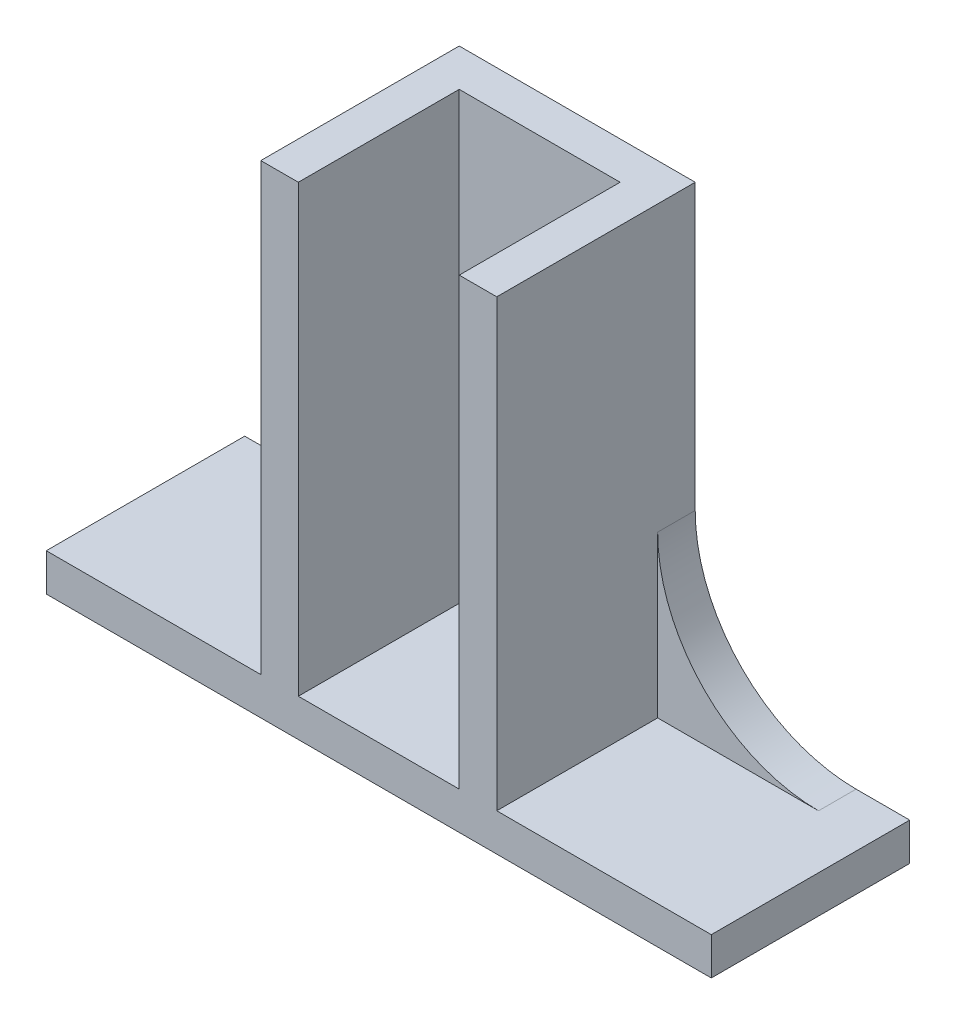
ISO-10303-21;
HEADER;
FILE_DESCRIPTION(('STEP AP214'),'2;1');
FILE_NAME('part.step','',(''),(''),'','','');
FILE_SCHEMA(('AUTOMOTIVE_DESIGN { 1 0 10303 214 1 1 1 1 }'));
ENDSEC;
DATA;
#1=APPLICATION_CONTEXT('core data for automotive mechanical design processes');
#2=APPLICATION_PROTOCOL_DEFINITION('international standard','automotive_design',2000,#1);
#3=PRODUCT_CONTEXT('',#1,'mechanical');
#4=PRODUCT('Part','Part','',(#3));
#5=PRODUCT_RELATED_PRODUCT_CATEGORY('part','',(#4));
#6=PRODUCT_DEFINITION_FORMATION('','',#4);
#7=PRODUCT_DEFINITION_CONTEXT('part definition',#1,'design');
#8=PRODUCT_DEFINITION('design','',#6,#7);
#9=PRODUCT_DEFINITION_SHAPE('','',#8);
#10=(LENGTH_UNIT() NAMED_UNIT(*) SI_UNIT(.MILLI.,.METRE.));
#11=(NAMED_UNIT(*) PLANE_ANGLE_UNIT() SI_UNIT($,.RADIAN.));
#12=(NAMED_UNIT(*) SI_UNIT($,.STERADIAN.) SOLID_ANGLE_UNIT());
#13=UNCERTAINTY_MEASURE_WITH_UNIT(LENGTH_MEASURE(1.E-05),#10,'distance_accuracy_value','');
#14=(GEOMETRIC_REPRESENTATION_CONTEXT(3) GLOBAL_UNCERTAINTY_ASSIGNED_CONTEXT((#13)) GLOBAL_UNIT_ASSIGNED_CONTEXT((#10,
#11,#12)) REPRESENTATION_CONTEXT('',''));
#15=CARTESIAN_POINT('',(0.,0.,0.));
#16=DIRECTION('',(0.,0.,1.));
#17=DIRECTION('',(1.,0.,0.));
#18=AXIS2_PLACEMENT_3D('',#15,#16,#17);
#19=CARTESIAN_POINT('',(5.860710547504,44.868914655892,18.5));
#20=DIRECTION('',(-1.,0.,0.));
#21=DIRECTION('',(0.,-1.,0.));
#22=AXIS2_PLACEMENT_3D('',#19,#20,#21);
#23=PLANE('',#22);
#24=DIRECTION('',(0.,0.,-1.));
#25=VECTOR('',#24,1.);
#26=CARTESIAN_POINT('',(5.86071054750401,18.368914655892,3.5));
#27=LINE('',#26,#25);
#28=CARTESIAN_POINT('',(5.86071054750401,18.368914655892,3.5));
#29=VERTEX_POINT('',#28);
#30=CARTESIAN_POINT('',(5.86071054750401,18.368914655892,0.));
#31=VERTEX_POINT('',#30);
#32=EDGE_CURVE('E167',#29,#31,#27,.T.);
#33=ORIENTED_EDGE('',*,*,#32,.T.);
#34=DIRECTION('',(0.,1.,0.));
#35=VECTOR('',#34,1.);
#36=CARTESIAN_POINT('',(5.860710547504,44.868914655892,0.));
#37=LINE('',#36,#35);
#38=CARTESIAN_POINT('',(5.860710547504,44.868914655892,0.));
#39=VERTEX_POINT('',#38);
#40=EDGE_CURVE('E37',#31,#39,#37,.T.);
#41=ORIENTED_EDGE('',*,*,#40,.T.);
#42=DIRECTION('',(0.,0.,-1.));
#43=VECTOR('',#42,1.);
#44=CARTESIAN_POINT('',(5.860710547504,44.868914655892,18.5));
#45=LINE('',#44,#43);
#46=CARTESIAN_POINT('',(5.860710547504,44.868914655892,18.5));
#47=VERTEX_POINT('',#46);
#48=EDGE_CURVE('E11',#47,#39,#45,.T.);
#49=ORIENTED_EDGE('',*,*,#48,.F.);
#50=DIRECTION('',(0.,1.,0.));
#51=VECTOR('',#50,1.);
#52=CARTESIAN_POINT('',(5.860710547504,44.868914655892,18.5));
#53=LINE('',#52,#51);
#54=CARTESIAN_POINT('',(5.86071054750401,3.36891465589196,18.5));
#55=VERTEX_POINT('',#54);
#56=EDGE_CURVE('E260',#55,#47,#53,.T.);
#57=ORIENTED_EDGE('',*,*,#56,.F.);
#58=DIRECTION('',(0.,0.,-1.));
#59=VECTOR('',#58,1.);
#60=CARTESIAN_POINT('',(5.86071054750401,3.36891465589196,38.803940504247));
#61=LINE('',#60,#59);
#62=CARTESIAN_POINT('',(5.86071054750401,3.36891465589199,3.5));
#63=VERTEX_POINT('',#62);
#64=EDGE_CURVE('E204',#55,#63,#61,.T.);
#65=ORIENTED_EDGE('',*,*,#64,.T.);
#66=DIRECTION('',(0.,1.,0.));
#67=VECTOR('',#66,1.);
#68=CARTESIAN_POINT('',(5.86071054750401,3.36891465589199,3.5));
#69=LINE('',#68,#67);
#70=EDGE_CURVE('E156',#63,#29,#69,.T.);
#71=ORIENTED_EDGE('',*,*,#70,.T.);
#72=EDGE_LOOP('',(#33,#41,#49,#57,#65,#71));
#73=FACE_BOUND('',#72,.T.);
#74=ADVANCED_FACE('F33',(#73),#23,.F.);
#75=CARTESIAN_POINT('',(5.86071054750401,3.36891465589196,38.803940504247));
#76=DIRECTION('',(0.,1.,0.));
#77=DIRECTION('',(-1.,0.,0.));
#78=AXIS2_PLACEMENT_3D('',#75,#76,#77);
#79=PLANE('',#78);
#80=DIRECTION('',(1.,0.,0.));
#81=VECTOR('',#80,1.);
#82=CARTESIAN_POINT('',(5.86071054750401,3.36891465589196,0.));
#83=LINE('',#82,#81);
#84=CARTESIAN_POINT('',(20.860710547504,3.36891465589195,0.));
#85=VERTEX_POINT('',#84);
#86=CARTESIAN_POINT('',(25.860710547504,3.36891465589195,0.));
#87=VERTEX_POINT('',#86);
#88=EDGE_CURVE('E171',#85,#87,#83,.T.);
#89=ORIENTED_EDGE('',*,*,#88,.F.);
#90=DIRECTION('',(0.,0.,-1.));
#91=VECTOR('',#90,1.);
#92=CARTESIAN_POINT('',(20.860710547504,3.36891465589199,3.5));
#93=LINE('',#92,#91);
#94=CARTESIAN_POINT('',(20.860710547504,3.36891465589199,3.5));
#95=VERTEX_POINT('',#94);
#96=EDGE_CURVE('E164',#95,#85,#93,.T.);
#97=ORIENTED_EDGE('',*,*,#96,.F.);
#98=DIRECTION('',(-1.,0.,0.));
#99=VECTOR('',#98,1.);
#100=CARTESIAN_POINT('',(20.860710547504,3.36891465589199,3.5));
#101=LINE('',#100,#99);
#102=EDGE_CURVE('E151',#95,#63,#101,.T.);
#103=ORIENTED_EDGE('',*,*,#102,.T.);
#104=ORIENTED_EDGE('',*,*,#64,.F.);
#105=DIRECTION('',(1.,0.,0.));
#106=VECTOR('',#105,1.);
#107=CARTESIAN_POINT('',(5.86071054750401,3.36891465589196,18.5));
#108=LINE('',#107,#106);
#109=CARTESIAN_POINT('',(25.860710547504,3.36891465589195,18.5));
#110=VERTEX_POINT('',#109);
#111=EDGE_CURVE('E196',#55,#110,#108,.T.);
#112=ORIENTED_EDGE('',*,*,#111,.T.);
#113=DIRECTION('',(0.,0.,-1.));
#114=VECTOR('',#113,1.);
#115=CARTESIAN_POINT('',(25.860710547504,3.36891465589195,38.803940504247));
#116=LINE('',#115,#114);
#117=EDGE_CURVE('E201',#110,#87,#116,.T.);
#118=ORIENTED_EDGE('',*,*,#117,.T.);
#119=EDGE_LOOP('',(#89,#97,#103,#104,#112,#118));
#120=FACE_BOUND('',#119,.T.);
#121=ADVANCED_FACE('F169',(#120),#79,.T.);
#122=CARTESIAN_POINT('',(-16.139289452496,44.868914655892,18.5));
#123=DIRECTION('',(1.,0.,0.));
#124=DIRECTION('',(0.,1.,0.));
#125=AXIS2_PLACEMENT_3D('',#122,#123,#124);
#126=PLANE('',#125);
#127=DIRECTION('',(0.,-1.,0.));
#128=VECTOR('',#127,1.);
#129=CARTESIAN_POINT('',(-16.139289452496,44.868914655892,0.));
#130=LINE('',#129,#128);
#131=CARTESIAN_POINT('',(-16.139289452496,44.868914655892,0.));
#132=VERTEX_POINT('',#131);
#133=CARTESIAN_POINT('',(-16.139289452496,18.368914655892,0.));
#134=VERTEX_POINT('',#133);
#135=EDGE_CURVE('E234',#132,#134,#130,.T.);
#136=ORIENTED_EDGE('',*,*,#135,.T.);
#137=DIRECTION('',(0.,0.,-1.));
#138=VECTOR('',#137,1.);
#139=CARTESIAN_POINT('',(-16.139289452496,18.368914655892,3.5));
#140=LINE('',#139,#138);
#141=CARTESIAN_POINT('',(-16.139289452496,18.368914655892,3.5));
#142=VERTEX_POINT('',#141);
#143=EDGE_CURVE('E186',#142,#134,#140,.T.);
#144=ORIENTED_EDGE('',*,*,#143,.F.);
#145=DIRECTION('',(0.,-1.,0.));
#146=VECTOR('',#145,1.);
#147=CARTESIAN_POINT('',(-16.139289452496,3.36891465589196,3.5));
#148=LINE('',#147,#146);
#149=CARTESIAN_POINT('',(-16.139289452496,3.36891465589196,3.5));
#150=VERTEX_POINT('',#149);
#151=EDGE_CURVE('E181',#142,#150,#148,.T.);
#152=ORIENTED_EDGE('',*,*,#151,.T.);
#153=DIRECTION('',(0.,0.,-1.));
#154=VECTOR('',#153,1.);
#155=CARTESIAN_POINT('',(-16.139289452496,3.36891465589196,38.803940504247));
#156=LINE('',#155,#154);
#157=CARTESIAN_POINT('',(-16.139289452496,3.36891465589199,18.5));
#158=VERTEX_POINT('',#157);
#159=EDGE_CURVE('E59',#158,#150,#156,.T.);
#160=ORIENTED_EDGE('',*,*,#159,.F.);
#161=DIRECTION('',(0.,-1.,0.));
#162=VECTOR('',#161,1.);
#163=CARTESIAN_POINT('',(-16.139289452496,44.868914655892,18.5));
#164=LINE('',#163,#162);
#165=CARTESIAN_POINT('',(-16.139289452496,44.868914655892,18.5));
#166=VERTEX_POINT('',#165);
#167=EDGE_CURVE('E246',#166,#158,#164,.T.);
#168=ORIENTED_EDGE('',*,*,#167,.F.);
#169=DIRECTION('',(0.,0.,-1.));
#170=VECTOR('',#169,1.);
#171=CARTESIAN_POINT('',(-16.139289452496,44.868914655892,18.5));
#172=LINE('',#171,#170);
#173=EDGE_CURVE('E43',#166,#132,#172,.T.);
#174=ORIENTED_EDGE('',*,*,#173,.T.);
#175=EDGE_LOOP('',(#136,#144,#152,#160,#168,#174));
#176=FACE_BOUND('',#175,.T.);
#177=ADVANCED_FACE('F35',(#176),#126,.F.);
#178=CARTESIAN_POINT('',(-16.139289452496,-0.131085344108044,18.5));
#179=DIRECTION('',(0.,1.,0.));
#180=DIRECTION('',(0.,0.,1.));
#181=AXIS2_PLACEMENT_3D('',#178,#179,#180);
#182=PLANE('',#181);
#183=DIRECTION('',(1.,0.,0.));
#184=VECTOR('',#183,1.);
#185=CARTESIAN_POINT('',(-16.139289452496,-0.131085344108044,0.));
#186=LINE('',#185,#184);
#187=CARTESIAN_POINT('',(-36.139289452496,-0.131085344108044,0.));
#188=VERTEX_POINT('',#187);
#189=CARTESIAN_POINT('',(25.860710547504,-0.131085344108046,0.));
#190=VERTEX_POINT('',#189);
#191=EDGE_CURVE('E229',#188,#190,#186,.T.);
#192=ORIENTED_EDGE('',*,*,#191,.T.);
#193=DIRECTION('',(0.,0.,-1.));
#194=VECTOR('',#193,1.);
#195=CARTESIAN_POINT('',(25.860710547504,-0.131085344108046,38.803940504247));
#196=LINE('',#195,#194);
#197=CARTESIAN_POINT('',(25.860710547504,-0.131085344108046,18.5));
#198=VERTEX_POINT('',#197);
#199=EDGE_CURVE('E200',#198,#190,#196,.T.);
#200=ORIENTED_EDGE('',*,*,#199,.F.);
#201=DIRECTION('',(1.,0.,0.));
#202=VECTOR('',#201,1.);
#203=CARTESIAN_POINT('',(-16.139289452496,-0.131085344108044,18.5));
#204=LINE('',#203,#202);
#205=CARTESIAN_POINT('',(-36.139289452496,-0.131085344108044,18.5));
#206=VERTEX_POINT('',#205);
#207=EDGE_CURVE('E227',#206,#198,#204,.T.);
#208=ORIENTED_EDGE('',*,*,#207,.F.);
#209=DIRECTION('',(0.,0.,-1.));
#210=VECTOR('',#209,1.);
#211=CARTESIAN_POINT('',(-36.139289452496,-0.131085344108044,38.803940504247));
#212=LINE('',#211,#210);
#213=EDGE_CURVE('E231',#206,#188,#212,.T.);
#214=ORIENTED_EDGE('',*,*,#213,.T.);
#215=EDGE_LOOP('',(#192,#200,#208,#214));
#216=FACE_BOUND('',#215,.T.);
#217=ADVANCED_FACE('F225',(#216),#182,.F.);
#218=CARTESIAN_POINT('',(-16.139289452496,44.868914655892,18.5));
#219=DIRECTION('',(0.,-1.,0.));
#220=DIRECTION('',(0.,0.,-1.));
#221=AXIS2_PLACEMENT_3D('',#218,#219,#220);
#222=PLANE('',#221);
#223=DIRECTION('',(-1.,0.,0.));
#224=VECTOR('',#223,1.);
#225=CARTESIAN_POINT('',(-16.139289452496,44.868914655892,18.5));
#226=LINE('',#225,#224);
#227=CARTESIAN_POINT('',(-12.639289452496,44.868914655892,18.5));
#228=VERTEX_POINT('',#227);
#229=EDGE_CURVE('E263',#228,#166,#226,.T.);
#230=ORIENTED_EDGE('',*,*,#229,.F.);
#231=DIRECTION('',(0.,0.,1.));
#232=VECTOR('',#231,1.);
#233=CARTESIAN_POINT('',(-12.639289452496,44.868914655892,3.5));
#234=LINE('',#233,#232);
#235=CARTESIAN_POINT('',(-12.639289452496,44.868914655892,3.5));
#236=VERTEX_POINT('',#235);
#237=EDGE_CURVE('E238',#236,#228,#234,.T.);
#238=ORIENTED_EDGE('',*,*,#237,.F.);
#239=DIRECTION('',(-1.,0.,0.));
#240=VECTOR('',#239,1.);
#241=CARTESIAN_POINT('',(-12.639289452496,44.868914655892,3.5));
#242=LINE('',#241,#240);
#243=CARTESIAN_POINT('',(2.36071054750401,44.868914655892,3.5));
#244=VERTEX_POINT('',#243);
#245=EDGE_CURVE('E297',#244,#236,#242,.T.);
#246=ORIENTED_EDGE('',*,*,#245,.F.);
#247=DIRECTION('',(0.,0.,1.));
#248=VECTOR('',#247,1.);
#249=CARTESIAN_POINT('',(2.36071054750401,44.868914655892,3.5));
#250=LINE('',#249,#248);
#251=CARTESIAN_POINT('',(2.36071054750401,44.868914655892,18.5));
#252=VERTEX_POINT('',#251);
#253=EDGE_CURVE('E303',#244,#252,#250,.T.);
#254=ORIENTED_EDGE('',*,*,#253,.T.);
#255=EDGE_CURVE('E248',#47,#252,#226,.T.);
#256=ORIENTED_EDGE('',*,*,#255,.F.);
#257=ORIENTED_EDGE('',*,*,#48,.T.);
#258=DIRECTION('',(-1.,0.,0.));
#259=VECTOR('',#258,1.);
#260=CARTESIAN_POINT('',(-16.139289452496,44.868914655892,0.));
#261=LINE('',#260,#259);
#262=EDGE_CURVE('E236',#39,#132,#261,.T.);
#263=ORIENTED_EDGE('',*,*,#262,.T.);
#264=ORIENTED_EDGE('',*,*,#173,.F.);
#265=EDGE_LOOP('',(#230,#238,#246,#254,#256,#257,#263,#264));
#266=FACE_BOUND('',#265,.T.);
#267=ADVANCED_FACE('F332',(#266),#222,.F.);
#268=CARTESIAN_POINT('',(0.,0.,18.5));
#269=DIRECTION('',(0.,0.,1.));
#270=DIRECTION('',(1.,0.,0.));
#271=AXIS2_PLACEMENT_3D('',#268,#269,#270);
#272=PLANE('',#271);
#273=DIRECTION('',(0.,-1.,0.));
#274=VECTOR('',#273,1.);
#275=CARTESIAN_POINT('',(-12.639289452496,44.868914655892,18.5));
#276=LINE('',#275,#274);
#277=CARTESIAN_POINT('',(-12.639289452496,3.36891465589196,18.5));
#278=VERTEX_POINT('',#277);
#279=EDGE_CURVE('E287',#228,#278,#276,.T.);
#280=ORIENTED_EDGE('',*,*,#279,.F.);
#281=ORIENTED_EDGE('',*,*,#229,.T.);
#282=ORIENTED_EDGE('',*,*,#167,.T.);
#283=DIRECTION('',(1.,0.,0.));
#284=VECTOR('',#283,1.);
#285=CARTESIAN_POINT('',(-16.139289452496,3.36891465589196,18.5));
#286=LINE('',#285,#284);
#287=CARTESIAN_POINT('',(-36.139289452496,3.36891465589196,18.5));
#288=VERTEX_POINT('',#287);
#289=EDGE_CURVE('E266',#288,#158,#286,.T.);
#290=ORIENTED_EDGE('',*,*,#289,.F.);
#291=DIRECTION('',(0.,1.,0.));
#292=VECTOR('',#291,1.);
#293=CARTESIAN_POINT('',(-36.139289452496,-0.131085344108044,18.5));
#294=LINE('',#293,#292);
#295=EDGE_CURVE('E274',#206,#288,#294,.T.);
#296=ORIENTED_EDGE('',*,*,#295,.F.);
#297=ORIENTED_EDGE('',*,*,#207,.T.);
#298=DIRECTION('',(0.,-1.,0.));
#299=VECTOR('',#298,1.);
#300=CARTESIAN_POINT('',(25.860710547504,-0.131085344108046,18.5));
#301=LINE('',#300,#299);
#302=EDGE_CURVE('E197',#110,#198,#301,.T.);
#303=ORIENTED_EDGE('',*,*,#302,.F.);
#304=ORIENTED_EDGE('',*,*,#111,.F.);
#305=ORIENTED_EDGE('',*,*,#56,.T.);
#306=ORIENTED_EDGE('',*,*,#255,.T.);
#307=DIRECTION('',(0.,1.,0.));
#308=VECTOR('',#307,1.);
#309=CARTESIAN_POINT('',(2.36071054750401,44.868914655892,18.5));
#310=LINE('',#309,#308);
#311=CARTESIAN_POINT('',(2.36071054750401,3.36891465589196,18.5));
#312=VERTEX_POINT('',#311);
#313=EDGE_CURVE('E294',#312,#252,#310,.T.);
#314=ORIENTED_EDGE('',*,*,#313,.F.);
#315=DIRECTION('',(1.,0.,0.));
#316=VECTOR('',#315,1.);
#317=CARTESIAN_POINT('',(-12.639289452496,3.36891465589196,18.5));
#318=LINE('',#317,#316);
#319=EDGE_CURVE('E288',#278,#312,#318,.T.);
#320=ORIENTED_EDGE('',*,*,#319,.F.);
#321=EDGE_LOOP('',(#280,#281,#282,#290,#296,#297,#303,#304,#305,#306,#314,#320));
#322=FACE_BOUND('',#321,.T.);
#323=ADVANCED_FACE('F326',(#322),#272,.T.);
#324=CARTESIAN_POINT('',(0.,0.,0.));
#325=DIRECTION('',(0.,0.,1.));
#326=DIRECTION('',(1.,0.,0.));
#327=AXIS2_PLACEMENT_3D('',#324,#325,#326);
#328=PLANE('',#327);
#329=ORIENTED_EDGE('',*,*,#40,.F.);
#330=CARTESIAN_POINT('',(20.8607105475041,18.3689146558921,0.));
#331=DIRECTION('',(0.,0.,1.));
#332=DIRECTION('',(1.,0.,0.));
#333=AXIS2_PLACEMENT_3D('',#330,#331,#332);
#334=CIRCLE('',#333,15.0000000000001);
#335=EDGE_CURVE('E51',#31,#85,#334,.T.);
#336=ORIENTED_EDGE('',*,*,#335,.T.);
#337=ORIENTED_EDGE('',*,*,#88,.T.);
#338=DIRECTION('',(0.,-1.,0.));
#339=VECTOR('',#338,1.);
#340=CARTESIAN_POINT('',(25.860710547504,-0.131085344108046,0.));
#341=LINE('',#340,#339);
#342=EDGE_CURVE('E193',#87,#190,#341,.T.);
#343=ORIENTED_EDGE('',*,*,#342,.T.);
#344=ORIENTED_EDGE('',*,*,#191,.F.);
#345=DIRECTION('',(0.,1.,0.));
#346=VECTOR('',#345,1.);
#347=CARTESIAN_POINT('',(-36.139289452496,-0.131085344108044,0.));
#348=LINE('',#347,#346);
#349=CARTESIAN_POINT('',(-36.139289452496,3.36891465589196,0.));
#350=VERTEX_POINT('',#349);
#351=EDGE_CURVE('E208',#188,#350,#348,.T.);
#352=ORIENTED_EDGE('',*,*,#351,.T.);
#353=DIRECTION('',(1.,0.,0.));
#354=VECTOR('',#353,1.);
#355=CARTESIAN_POINT('',(-16.139289452496,3.36891465589196,0.));
#356=LINE('',#355,#354);
#357=CARTESIAN_POINT('',(-31.139289452496,3.36891465589196,0.));
#358=VERTEX_POINT('',#357);
#359=EDGE_CURVE('E271',#350,#358,#356,.T.);
#360=ORIENTED_EDGE('',*,*,#359,.T.);
#361=CARTESIAN_POINT('',(-31.1392894524961,18.3689146558921,0.));
#362=DIRECTION('',(0.,0.,1.));
#363=DIRECTION('',(-1.,0.,0.));
#364=AXIS2_PLACEMENT_3D('',#361,#362,#363);
#365=CIRCLE('',#364,15.0000000000001);
#366=EDGE_CURVE('E173',#358,#134,#365,.T.);
#367=ORIENTED_EDGE('',*,*,#366,.T.);
#368=ORIENTED_EDGE('',*,*,#135,.F.);
#369=ORIENTED_EDGE('',*,*,#262,.F.);
#370=EDGE_LOOP('',(#329,#336,#337,#343,#344,#352,#360,#367,#368,#369));
#371=FACE_BOUND('',#370,.T.);
#372=ADVANCED_FACE('F218',(#371),#328,.F.);
#373=CARTESIAN_POINT('',(-12.639289452496,44.868914655892,3.5));
#374=DIRECTION('',(-1.,0.,0.));
#375=DIRECTION('',(0.,-1.,0.));
#376=AXIS2_PLACEMENT_3D('',#373,#374,#375);
#377=PLANE('',#376);
#378=ORIENTED_EDGE('',*,*,#279,.T.);
#379=DIRECTION('',(0.,0.,1.));
#380=VECTOR('',#379,1.);
#381=CARTESIAN_POINT('',(-12.639289452496,3.36891465589196,3.5));
#382=LINE('',#381,#380);
#383=CARTESIAN_POINT('',(-12.639289452496,3.36891465589196,3.5));
#384=VERTEX_POINT('',#383);
#385=EDGE_CURVE('E257',#384,#278,#382,.T.);
#386=ORIENTED_EDGE('',*,*,#385,.F.);
#387=DIRECTION('',(0.,-1.,0.));
#388=VECTOR('',#387,1.);
#389=CARTESIAN_POINT('',(-12.639289452496,44.868914655892,3.5));
#390=LINE('',#389,#388);
#391=EDGE_CURVE('E301',#236,#384,#390,.T.);
#392=ORIENTED_EDGE('',*,*,#391,.F.);
#393=ORIENTED_EDGE('',*,*,#237,.T.);
#394=EDGE_LOOP('',(#378,#386,#392,#393));
#395=FACE_BOUND('',#394,.T.);
#396=ADVANCED_FACE('F340',(#395),#377,.F.);
#397=CARTESIAN_POINT('',(2.36071054750401,44.868914655892,3.5));
#398=DIRECTION('',(1.,0.,0.));
#399=DIRECTION('',(0.,1.,0.));
#400=AXIS2_PLACEMENT_3D('',#397,#398,#399);
#401=PLANE('',#400);
#402=ORIENTED_EDGE('',*,*,#313,.T.);
#403=ORIENTED_EDGE('',*,*,#253,.F.);
#404=DIRECTION('',(0.,1.,0.));
#405=VECTOR('',#404,1.);
#406=CARTESIAN_POINT('',(2.36071054750401,44.868914655892,3.5));
#407=LINE('',#406,#405);
#408=CARTESIAN_POINT('',(2.36071054750401,3.36891465589196,3.5));
#409=VERTEX_POINT('',#408);
#410=EDGE_CURVE('E312',#409,#244,#407,.T.);
#411=ORIENTED_EDGE('',*,*,#410,.F.);
#412=DIRECTION('',(0.,0.,1.));
#413=VECTOR('',#412,1.);
#414=CARTESIAN_POINT('',(2.36071054750401,3.36891465589196,3.5));
#415=LINE('',#414,#413);
#416=EDGE_CURVE('E305',#409,#312,#415,.T.);
#417=ORIENTED_EDGE('',*,*,#416,.T.);
#418=EDGE_LOOP('',(#402,#403,#411,#417));
#419=FACE_BOUND('',#418,.T.);
#420=ADVANCED_FACE('F339',(#419),#401,.F.);
#421=CARTESIAN_POINT('',(-12.639289452496,3.36891465589196,3.5));
#422=DIRECTION('',(0.,-1.,0.));
#423=DIRECTION('',(1.,0.,0.));
#424=AXIS2_PLACEMENT_3D('',#421,#422,#423);
#425=PLANE('',#424);
#426=ORIENTED_EDGE('',*,*,#319,.T.);
#427=ORIENTED_EDGE('',*,*,#416,.F.);
#428=DIRECTION('',(1.,0.,0.));
#429=VECTOR('',#428,1.);
#430=CARTESIAN_POINT('',(-12.639289452496,3.36891465589196,3.5));
#431=LINE('',#430,#429);
#432=EDGE_CURVE('E318',#384,#409,#431,.T.);
#433=ORIENTED_EDGE('',*,*,#432,.F.);
#434=ORIENTED_EDGE('',*,*,#385,.T.);
#435=EDGE_LOOP('',(#426,#427,#433,#434));
#436=FACE_BOUND('',#435,.T.);
#437=ADVANCED_FACE('F342',(#436),#425,.F.);
#438=CARTESIAN_POINT('',(0.,0.,3.5));
#439=DIRECTION('',(0.,0.,1.));
#440=DIRECTION('',(1.,0.,0.));
#441=AXIS2_PLACEMENT_3D('',#438,#439,#440);
#442=PLANE('',#441);
#443=ORIENTED_EDGE('',*,*,#391,.T.);
#444=ORIENTED_EDGE('',*,*,#432,.T.);
#445=ORIENTED_EDGE('',*,*,#410,.T.);
#446=ORIENTED_EDGE('',*,*,#245,.T.);
#447=EDGE_LOOP('',(#443,#444,#445,#446));
#448=FACE_BOUND('',#447,.T.);
#449=ADVANCED_FACE('F341',(#448),#442,.T.);
#450=CARTESIAN_POINT('',(-36.139289452496,-0.131085344108044,38.803940504247));
#451=DIRECTION('',(-1.,0.,0.));
#452=DIRECTION('',(0.,0.,1.));
#453=AXIS2_PLACEMENT_3D('',#450,#451,#452);
#454=PLANE('',#453);
#455=ORIENTED_EDGE('',*,*,#213,.F.);
#456=ORIENTED_EDGE('',*,*,#295,.T.);
#457=DIRECTION('',(0.,0.,-1.));
#458=VECTOR('',#457,1.);
#459=CARTESIAN_POINT('',(-36.139289452496,3.36891465589196,38.803940504247));
#460=LINE('',#459,#458);
#461=EDGE_CURVE('E269',#288,#350,#460,.T.);
#462=ORIENTED_EDGE('',*,*,#461,.T.);
#463=ORIENTED_EDGE('',*,*,#351,.F.);
#464=EDGE_LOOP('',(#455,#456,#462,#463));
#465=FACE_BOUND('',#464,.T.);
#466=ADVANCED_FACE('F324',(#465),#454,.T.);
#467=CARTESIAN_POINT('',(-16.139289452496,3.36891465589196,38.803940504247));
#468=DIRECTION('',(0.,1.,0.));
#469=DIRECTION('',(0.,0.,1.));
#470=AXIS2_PLACEMENT_3D('',#467,#468,#469);
#471=PLANE('',#470);
#472=DIRECTION('',(0.,0.,-1.));
#473=VECTOR('',#472,1.);
#474=CARTESIAN_POINT('',(-31.139289452496,3.36891465589196,3.5));
#475=LINE('',#474,#473);
#476=CARTESIAN_POINT('',(-31.139289452496,3.36891465589196,3.5));
#477=VERTEX_POINT('',#476);
#478=EDGE_CURVE('E189',#477,#358,#475,.T.);
#479=ORIENTED_EDGE('',*,*,#478,.T.);
#480=ORIENTED_EDGE('',*,*,#359,.F.);
#481=ORIENTED_EDGE('',*,*,#461,.F.);
#482=ORIENTED_EDGE('',*,*,#289,.T.);
#483=ORIENTED_EDGE('',*,*,#159,.T.);
#484=DIRECTION('',(-1.,0.,0.));
#485=VECTOR('',#484,1.);
#486=CARTESIAN_POINT('',(-31.139289452496,3.36891465589196,3.5));
#487=LINE('',#486,#485);
#488=EDGE_CURVE('E183',#150,#477,#487,.T.);
#489=ORIENTED_EDGE('',*,*,#488,.T.);
#490=EDGE_LOOP('',(#479,#480,#481,#482,#483,#489));
#491=FACE_BOUND('',#490,.T.);
#492=ADVANCED_FACE('F279',(#491),#471,.T.);
#493=CARTESIAN_POINT('',(25.860710547504,-0.131085344108046,38.803940504247));
#494=DIRECTION('',(1.,0.,0.));
#495=DIRECTION('',(0.,0.,-1.));
#496=AXIS2_PLACEMENT_3D('',#493,#494,#495);
#497=PLANE('',#496);
#498=ORIENTED_EDGE('',*,*,#117,.F.);
#499=ORIENTED_EDGE('',*,*,#302,.T.);
#500=ORIENTED_EDGE('',*,*,#199,.T.);
#501=ORIENTED_EDGE('',*,*,#342,.F.);
#502=EDGE_LOOP('',(#498,#499,#500,#501));
#503=FACE_BOUND('',#502,.T.);
#504=ADVANCED_FACE('F222',(#503),#497,.T.);
#505=CARTESIAN_POINT('',(-31.1392894524961,18.3689146558921,3.5));
#506=DIRECTION('',(0.,0.,-1.));
#507=DIRECTION('',(-1.,0.,0.));
#508=AXIS2_PLACEMENT_3D('',#505,#506,#507);
#509=CYLINDRICAL_SURFACE('',#508,15.0000000000001);
#510=ORIENTED_EDGE('',*,*,#366,.F.);
#511=ORIENTED_EDGE('',*,*,#478,.F.);
#512=CARTESIAN_POINT('',(-31.1392894524961,18.3689146558921,3.5));
#513=DIRECTION('',(0.,0.,1.));
#514=DIRECTION('',(-1.,0.,0.));
#515=AXIS2_PLACEMENT_3D('',#512,#513,#514);
#516=CIRCLE('',#515,15.0000000000001);
#517=EDGE_CURVE('E178',#477,#142,#516,.T.);
#518=ORIENTED_EDGE('',*,*,#517,.T.);
#519=ORIENTED_EDGE('',*,*,#143,.T.);
#520=EDGE_LOOP('',(#510,#511,#518,#519));
#521=FACE_BOUND('',#520,.T.);
#522=ADVANCED_FACE('F283',(#521),#509,.F.);
#523=CARTESIAN_POINT('',(-31.1392894524961,18.3689146558921,3.5));
#524=DIRECTION('',(0.,0.,-1.));
#525=DIRECTION('',(-1.,0.,0.));
#526=AXIS2_PLACEMENT_3D('',#523,#524,#525);
#527=PLANE('',#526);
#528=ORIENTED_EDGE('',*,*,#517,.F.);
#529=ORIENTED_EDGE('',*,*,#488,.F.);
#530=ORIENTED_EDGE('',*,*,#151,.F.);
#531=EDGE_LOOP('',(#528,#529,#530));
#532=FACE_BOUND('',#531,.T.);
#533=ADVANCED_FACE('F286',(#532),#527,.F.);
#534=CARTESIAN_POINT('',(20.8607105475041,18.3689146558921,3.5));
#535=DIRECTION('',(0.,0.,-1.));
#536=DIRECTION('',(-1.,0.,0.));
#537=AXIS2_PLACEMENT_3D('',#534,#535,#536);
#538=CYLINDRICAL_SURFACE('',#537,15.0000000000001);
#539=ORIENTED_EDGE('',*,*,#335,.F.);
#540=ORIENTED_EDGE('',*,*,#32,.F.);
#541=CARTESIAN_POINT('',(20.8607105475041,18.3689146558921,3.5));
#542=DIRECTION('',(0.,0.,1.));
#543=DIRECTION('',(1.,0.,0.));
#544=AXIS2_PLACEMENT_3D('',#541,#542,#543);
#545=CIRCLE('',#544,15.0000000000001);
#546=EDGE_CURVE('E154',#29,#95,#545,.T.);
#547=ORIENTED_EDGE('',*,*,#546,.T.);
#548=ORIENTED_EDGE('',*,*,#96,.T.);
#549=EDGE_LOOP('',(#539,#540,#547,#548));
#550=FACE_BOUND('',#549,.T.);
#551=ADVANCED_FACE('F163',(#550),#538,.F.);
#552=CARTESIAN_POINT('',(20.8607105475041,18.3689146558921,3.5));
#553=DIRECTION('',(0.,0.,1.));
#554=DIRECTION('',(1.,0.,0.));
#555=AXIS2_PLACEMENT_3D('',#552,#553,#554);
#556=PLANE('',#555);
#557=ORIENTED_EDGE('',*,*,#546,.F.);
#558=ORIENTED_EDGE('',*,*,#70,.F.);
#559=ORIENTED_EDGE('',*,*,#102,.F.);
#560=EDGE_LOOP('',(#557,#558,#559));
#561=FACE_BOUND('',#560,.T.);
#562=ADVANCED_FACE('F153',(#561),#556,.T.);
#563=CLOSED_SHELL('',(#74,#121,#177,#217,#267,#323,#372,#396,#420,#437,#449,#466,#492,#504,#522,
#533,#551,#562));
#564=MANIFOLD_SOLID_BREP('B2',#563);
#565=ADVANCED_BREP_SHAPE_REPRESENTATION('',(#18,#564),#14);
#566=SHAPE_DEFINITION_REPRESENTATION(#9,#565);
ENDSEC;
END-ISO-10303-21;
